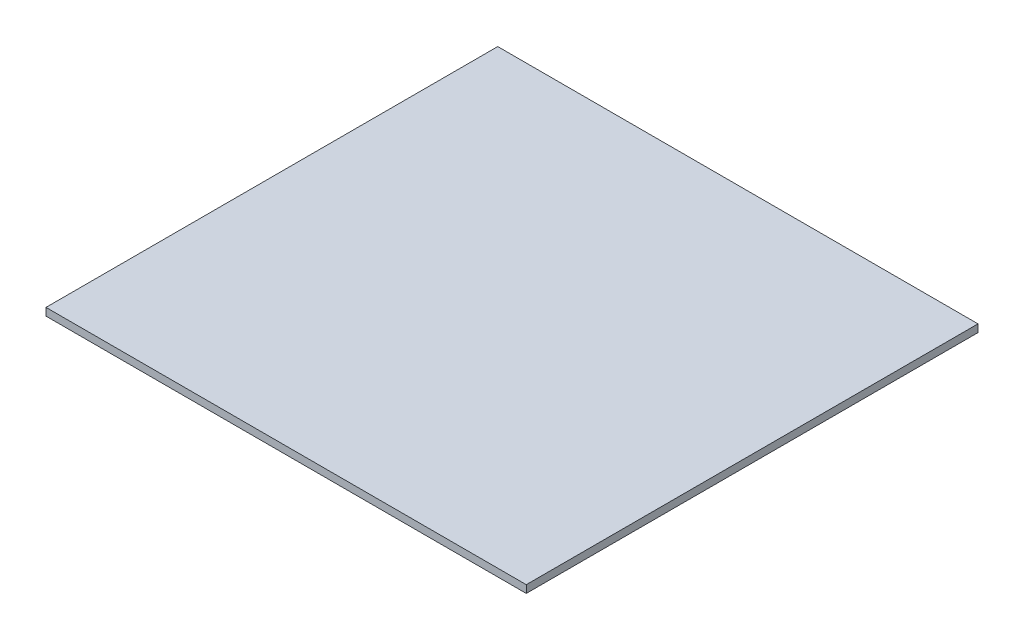
ISO-10303-21;
HEADER;
FILE_DESCRIPTION(('STEP AP214'),'2;1');
FILE_NAME('part.step','',(''),(''),'','','');
FILE_SCHEMA(('AUTOMOTIVE_DESIGN { 1 0 10303 214 1 1 1 1 }'));
ENDSEC;
DATA;
#1=APPLICATION_CONTEXT('core data for automotive mechanical design processes');
#2=APPLICATION_PROTOCOL_DEFINITION('international standard','automotive_design',2000,#1);
#3=PRODUCT_CONTEXT('',#1,'mechanical');
#4=PRODUCT('Part','Part','',(#3));
#5=PRODUCT_RELATED_PRODUCT_CATEGORY('part','',(#4));
#6=PRODUCT_DEFINITION_FORMATION('','',#4);
#7=PRODUCT_DEFINITION_CONTEXT('part definition',#1,'design');
#8=PRODUCT_DEFINITION('design','',#6,#7);
#9=PRODUCT_DEFINITION_SHAPE('','',#8);
#10=(LENGTH_UNIT() NAMED_UNIT(*) SI_UNIT(.MILLI.,.METRE.));
#11=(NAMED_UNIT(*) PLANE_ANGLE_UNIT() SI_UNIT($,.RADIAN.));
#12=(NAMED_UNIT(*) SI_UNIT($,.STERADIAN.) SOLID_ANGLE_UNIT());
#13=UNCERTAINTY_MEASURE_WITH_UNIT(LENGTH_MEASURE(1.E-05),#10,'distance_accuracy_value','');
#14=(GEOMETRIC_REPRESENTATION_CONTEXT(3) GLOBAL_UNCERTAINTY_ASSIGNED_CONTEXT((#13)) GLOBAL_UNIT_ASSIGNED_CONTEXT((#10,
#11,#12)) REPRESENTATION_CONTEXT('',''));
#15=CARTESIAN_POINT('',(0.,0.,0.));
#16=DIRECTION('',(0.,0.,1.));
#17=DIRECTION('',(1.,0.,0.));
#18=AXIS2_PLACEMENT_3D('',#15,#16,#17);
#19=CARTESIAN_POINT('',(-101.,-1.60000000000001,190.));
#20=DIRECTION('',(1.,0.,0.));
#21=DIRECTION('',(0.,0.,-1.));
#22=AXIS2_PLACEMENT_3D('',#19,#20,#21);
#23=PLANE('',#22);
#24=DIRECTION('',(0.,-1.,0.));
#25=VECTOR('',#24,1.);
#26=CARTESIAN_POINT('',(-101.,-1.60000000000001,0.));
#27=LINE('',#26,#25);
#28=CARTESIAN_POINT('',(-101.,1.59999999999999,0.));
#29=VERTEX_POINT('',#28);
#30=CARTESIAN_POINT('',(-101.,-1.60000000000001,0.));
#31=VERTEX_POINT('',#30);
#32=EDGE_CURVE('E96',#29,#31,#27,.T.);
#33=ORIENTED_EDGE('',*,*,#32,.T.);
#34=DIRECTION('',(0.,0.,-1.));
#35=VECTOR('',#34,1.);
#36=CARTESIAN_POINT('',(-101.,-1.60000000000001,190.));
#37=LINE('',#36,#35);
#38=CARTESIAN_POINT('',(-101.,-1.60000000000001,190.));
#39=VERTEX_POINT('',#38);
#40=EDGE_CURVE('E11',#39,#31,#37,.T.);
#41=ORIENTED_EDGE('',*,*,#40,.F.);
#42=DIRECTION('',(0.,-1.,0.));
#43=VECTOR('',#42,1.);
#44=CARTESIAN_POINT('',(-101.,-1.60000000000001,190.));
#45=LINE('',#44,#43);
#46=CARTESIAN_POINT('',(-101.,1.59999999999999,190.));
#47=VERTEX_POINT('',#46);
#48=EDGE_CURVE('E84',#47,#39,#45,.T.);
#49=ORIENTED_EDGE('',*,*,#48,.F.);
#50=DIRECTION('',(0.,0.,-1.));
#51=VECTOR('',#50,1.);
#52=CARTESIAN_POINT('',(-101.,1.59999999999999,190.));
#53=LINE('',#52,#51);
#54=EDGE_CURVE('E92',#47,#29,#53,.T.);
#55=ORIENTED_EDGE('',*,*,#54,.T.);
#56=EDGE_LOOP('',(#33,#41,#49,#55));
#57=FACE_BOUND('',#56,.T.);
#58=ADVANCED_FACE('F33',(#57),#23,.F.);
#59=CARTESIAN_POINT('',(101.,-1.59999999999999,190.));
#60=DIRECTION('',(0.,1.,0.));
#61=DIRECTION('',(-1.,0.,0.));
#62=AXIS2_PLACEMENT_3D('',#59,#60,#61);
#63=PLANE('',#62);
#64=DIRECTION('',(1.,0.,0.));
#65=VECTOR('',#64,1.);
#66=CARTESIAN_POINT('',(101.,-1.59999999999999,0.));
#67=LINE('',#66,#65);
#68=CARTESIAN_POINT('',(101.,-1.59999999999999,0.));
#69=VERTEX_POINT('',#68);
#70=EDGE_CURVE('E88',#31,#69,#67,.T.);
#71=ORIENTED_EDGE('',*,*,#70,.T.);
#72=DIRECTION('',(0.,0.,-1.));
#73=VECTOR('',#72,1.);
#74=CARTESIAN_POINT('',(101.,-1.59999999999999,190.));
#75=LINE('',#74,#73);
#76=CARTESIAN_POINT('',(101.,-1.59999999999999,190.));
#77=VERTEX_POINT('',#76);
#78=EDGE_CURVE('E41',#77,#69,#75,.T.);
#79=ORIENTED_EDGE('',*,*,#78,.F.);
#80=DIRECTION('',(1.,0.,0.));
#81=VECTOR('',#80,1.);
#82=CARTESIAN_POINT('',(101.,-1.59999999999999,190.));
#83=LINE('',#82,#81);
#84=EDGE_CURVE('E79',#39,#77,#83,.T.);
#85=ORIENTED_EDGE('',*,*,#84,.F.);
#86=ORIENTED_EDGE('',*,*,#40,.T.);
#87=EDGE_LOOP('',(#71,#79,#85,#86));
#88=FACE_BOUND('',#87,.T.);
#89=ADVANCED_FACE('F87',(#88),#63,.F.);
#90=CARTESIAN_POINT('',(101.,-1.59999999999999,190.));
#91=DIRECTION('',(-1.,0.,0.));
#92=DIRECTION('',(0.,0.,1.));
#93=AXIS2_PLACEMENT_3D('',#90,#91,#92);
#94=PLANE('',#93);
#95=DIRECTION('',(0.,1.,0.));
#96=VECTOR('',#95,1.);
#97=CARTESIAN_POINT('',(101.,-1.59999999999999,0.));
#98=LINE('',#97,#96);
#99=CARTESIAN_POINT('',(101.,1.60000000000001,0.));
#100=VERTEX_POINT('',#99);
#101=EDGE_CURVE('E66',#69,#100,#98,.T.);
#102=ORIENTED_EDGE('',*,*,#101,.T.);
#103=DIRECTION('',(0.,0.,-1.));
#104=VECTOR('',#103,1.);
#105=CARTESIAN_POINT('',(101.,1.60000000000001,190.));
#106=LINE('',#105,#104);
#107=CARTESIAN_POINT('',(101.,1.60000000000001,190.));
#108=VERTEX_POINT('',#107);
#109=EDGE_CURVE('E89',#108,#100,#106,.T.);
#110=ORIENTED_EDGE('',*,*,#109,.F.);
#111=DIRECTION('',(0.,1.,0.));
#112=VECTOR('',#111,1.);
#113=CARTESIAN_POINT('',(101.,-1.59999999999999,190.));
#114=LINE('',#113,#112);
#115=EDGE_CURVE('E82',#77,#108,#114,.T.);
#116=ORIENTED_EDGE('',*,*,#115,.F.);
#117=ORIENTED_EDGE('',*,*,#78,.T.);
#118=EDGE_LOOP('',(#102,#110,#116,#117));
#119=FACE_BOUND('',#118,.T.);
#120=ADVANCED_FACE('F90',(#119),#94,.F.);
#121=CARTESIAN_POINT('',(101.,1.60000000000001,190.));
#122=DIRECTION('',(0.,-1.,0.));
#123=DIRECTION('',(1.,0.,0.));
#124=AXIS2_PLACEMENT_3D('',#121,#122,#123);
#125=PLANE('',#124);
#126=DIRECTION('',(-1.,0.,0.));
#127=VECTOR('',#126,1.);
#128=CARTESIAN_POINT('',(101.,1.60000000000001,0.));
#129=LINE('',#128,#127);
#130=EDGE_CURVE('E72',#100,#29,#129,.T.);
#131=ORIENTED_EDGE('',*,*,#130,.T.);
#132=ORIENTED_EDGE('',*,*,#54,.F.);
#133=DIRECTION('',(-1.,0.,0.));
#134=VECTOR('',#133,1.);
#135=CARTESIAN_POINT('',(101.,1.60000000000001,190.));
#136=LINE('',#135,#134);
#137=EDGE_CURVE('E49',#108,#47,#136,.T.);
#138=ORIENTED_EDGE('',*,*,#137,.F.);
#139=ORIENTED_EDGE('',*,*,#109,.T.);
#140=EDGE_LOOP('',(#131,#132,#138,#139));
#141=FACE_BOUND('',#140,.T.);
#142=ADVANCED_FACE('F103',(#141),#125,.F.);
#143=CARTESIAN_POINT('',(0.,0.,190.));
#144=DIRECTION('',(0.,0.,1.));
#145=DIRECTION('',(1.,0.,0.));
#146=AXIS2_PLACEMENT_3D('',#143,#144,#145);
#147=PLANE('',#146);
#148=ORIENTED_EDGE('',*,*,#48,.T.);
#149=ORIENTED_EDGE('',*,*,#84,.T.);
#150=ORIENTED_EDGE('',*,*,#115,.T.);
#151=ORIENTED_EDGE('',*,*,#137,.T.);
#152=EDGE_LOOP('',(#148,#149,#150,#151));
#153=FACE_BOUND('',#152,.T.);
#154=ADVANCED_FACE('F80',(#153),#147,.T.);
#155=CARTESIAN_POINT('',(0.,0.,0.));
#156=DIRECTION('',(0.,0.,1.));
#157=DIRECTION('',(1.,0.,0.));
#158=AXIS2_PLACEMENT_3D('',#155,#156,#157);
#159=PLANE('',#158);
#160=ORIENTED_EDGE('',*,*,#32,.F.);
#161=ORIENTED_EDGE('',*,*,#130,.F.);
#162=ORIENTED_EDGE('',*,*,#101,.F.);
#163=ORIENTED_EDGE('',*,*,#70,.F.);
#164=EDGE_LOOP('',(#160,#161,#162,#163));
#165=FACE_BOUND('',#164,.T.);
#166=ADVANCED_FACE('F106',(#165),#159,.F.);
#167=CLOSED_SHELL('',(#58,#89,#120,#142,#154,#166));
#168=MANIFOLD_SOLID_BREP('B2',#167);
#169=ADVANCED_BREP_SHAPE_REPRESENTATION('',(#18,#168),#14);
#170=SHAPE_DEFINITION_REPRESENTATION(#9,#169);
ENDSEC;
END-ISO-10303-21;
